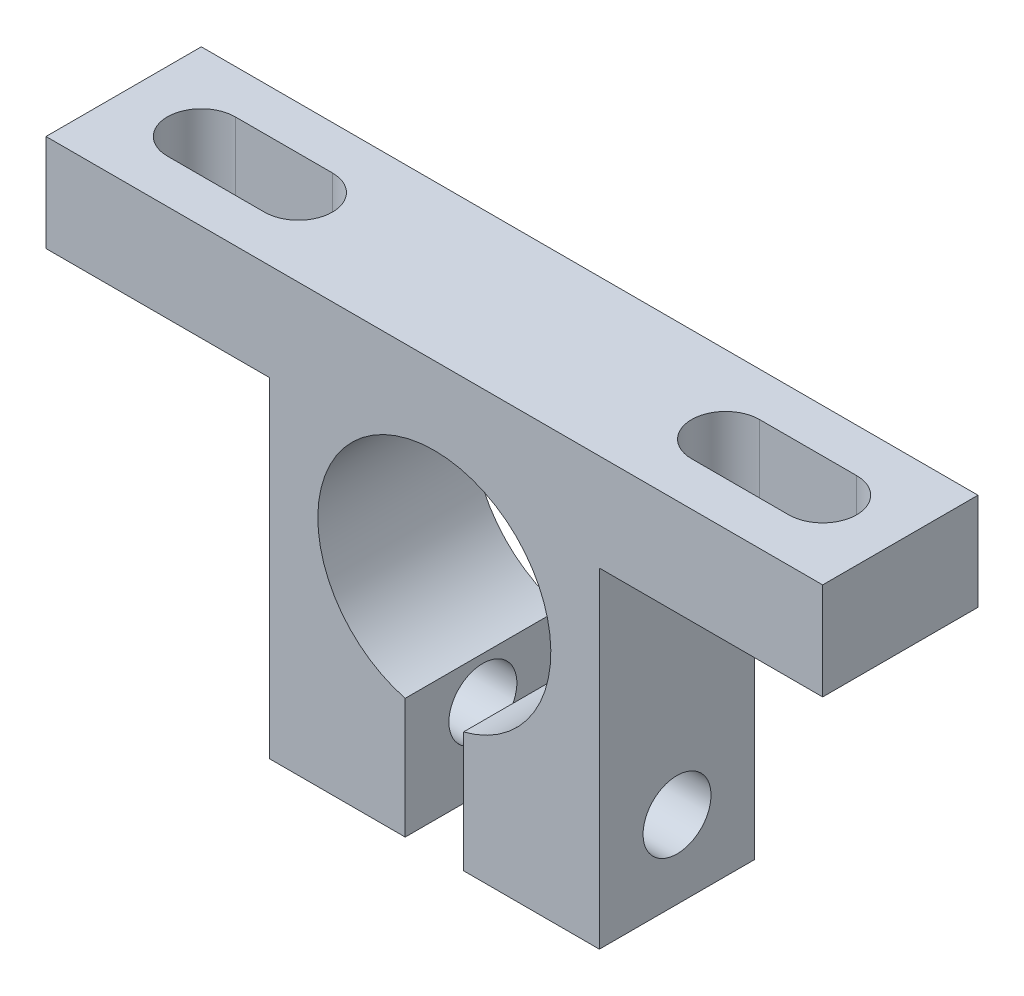
ISO-10303-21;
HEADER;
FILE_DESCRIPTION(('STEP AP214'),'2;1');
FILE_NAME('part.step','',(''),(''),'','','');
FILE_SCHEMA(('AUTOMOTIVE_DESIGN { 1 0 10303 214 1 1 1 1 }'));
ENDSEC;
DATA;
#1=APPLICATION_CONTEXT('core data for automotive mechanical design processes');
#2=APPLICATION_PROTOCOL_DEFINITION('international standard','automotive_design',2000,#1);
#3=PRODUCT_CONTEXT('',#1,'mechanical');
#4=PRODUCT('Part','Part','',(#3));
#5=PRODUCT_RELATED_PRODUCT_CATEGORY('part','',(#4));
#6=PRODUCT_DEFINITION_FORMATION('','',#4);
#7=PRODUCT_DEFINITION_CONTEXT('part definition',#1,'design');
#8=PRODUCT_DEFINITION('design','',#6,#7);
#9=PRODUCT_DEFINITION_SHAPE('','',#8);
#10=(LENGTH_UNIT() NAMED_UNIT(*) SI_UNIT(.MILLI.,.METRE.));
#11=(NAMED_UNIT(*) PLANE_ANGLE_UNIT() SI_UNIT($,.RADIAN.));
#12=(NAMED_UNIT(*) SI_UNIT($,.STERADIAN.) SOLID_ANGLE_UNIT());
#13=UNCERTAINTY_MEASURE_WITH_UNIT(LENGTH_MEASURE(1.E-05),#10,'distance_accuracy_value','');
#14=(GEOMETRIC_REPRESENTATION_CONTEXT(3) GLOBAL_UNCERTAINTY_ASSIGNED_CONTEXT((#13)) GLOBAL_UNIT_ASSIGNED_CONTEXT((#10,
#11,#12)) REPRESENTATION_CONTEXT('',''));
#15=CARTESIAN_POINT('',(0.,0.,0.));
#16=DIRECTION('',(0.,0.,1.));
#17=DIRECTION('',(1.,0.,0.));
#18=AXIS2_PLACEMENT_3D('',#15,#16,#17);
#19=CARTESIAN_POINT('',(8.5,-12.,8.));
#20=DIRECTION('',(0.,1.,0.));
#21=DIRECTION('',(0.,0.,1.));
#22=AXIS2_PLACEMENT_3D('',#19,#20,#21);
#23=PLANE('',#22);
#24=DIRECTION('',(1.,0.,0.));
#25=VECTOR('',#24,1.);
#26=CARTESIAN_POINT('',(8.5,-12.,0.));
#27=LINE('',#26,#25);
#28=CARTESIAN_POINT('',(1.5,-12.,0.));
#29=VERTEX_POINT('',#28);
#30=CARTESIAN_POINT('',(8.5,-12.,0.));
#31=VERTEX_POINT('',#30);
#32=EDGE_CURVE('E222',#29,#31,#27,.T.);
#33=ORIENTED_EDGE('',*,*,#32,.T.);
#34=DIRECTION('',(0.,0.,-1.));
#35=VECTOR('',#34,1.);
#36=CARTESIAN_POINT('',(8.5,-12.,8.));
#37=LINE('',#36,#35);
#38=CARTESIAN_POINT('',(8.5,-12.,8.));
#39=VERTEX_POINT('',#38);
#40=EDGE_CURVE('E311',#39,#31,#37,.T.);
#41=ORIENTED_EDGE('',*,*,#40,.F.);
#42=DIRECTION('',(1.,0.,0.));
#43=VECTOR('',#42,1.);
#44=CARTESIAN_POINT('',(8.5,-12.,8.));
#45=LINE('',#44,#43);
#46=CARTESIAN_POINT('',(1.5,-12.,8.));
#47=VERTEX_POINT('',#46);
#48=EDGE_CURVE('E229',#47,#39,#45,.T.);
#49=ORIENTED_EDGE('',*,*,#48,.F.);
#50=DIRECTION('',(0.,0.,-1.));
#51=VECTOR('',#50,1.);
#52=CARTESIAN_POINT('',(1.5,-12.,8.));
#53=LINE('',#52,#51);
#54=EDGE_CURVE('E255',#47,#29,#53,.T.);
#55=ORIENTED_EDGE('',*,*,#54,.T.);
#56=EDGE_LOOP('',(#33,#41,#49,#55));
#57=FACE_BOUND('',#56,.T.);
#58=ADVANCED_FACE('F34',(#57),#23,.F.);
#59=CARTESIAN_POINT('',(8.5,5.,8.));
#60=DIRECTION('',(-1.,0.,0.));
#61=DIRECTION('',(0.,0.,1.));
#62=AXIS2_PLACEMENT_3D('',#59,#60,#61);
#63=PLANE('',#62);
#64=CARTESIAN_POINT('',(8.5,-8.,4.));
#65=DIRECTION('',(-1.,0.,0.));
#66=DIRECTION('',(0.,0.,1.));
#67=AXIS2_PLACEMENT_3D('',#64,#65,#66);
#68=CIRCLE('',#67,1.75);
#69=CARTESIAN_POINT('',(8.5,-8.,5.75));
#70=VERTEX_POINT('',#69);
#71=EDGE_CURVE('E472',#70,#70,#68,.T.);
#72=ORIENTED_EDGE('',*,*,#71,.T.);
#73=EDGE_LOOP('',(#72));
#74=FACE_BOUND('',#73,.T.);
#75=DIRECTION('',(0.,1.,0.));
#76=VECTOR('',#75,1.);
#77=CARTESIAN_POINT('',(8.5,5.,0.));
#78=LINE('',#77,#76);
#79=CARTESIAN_POINT('',(8.5,5.,0.));
#80=VERTEX_POINT('',#79);
#81=EDGE_CURVE('E258',#31,#80,#78,.T.);
#82=ORIENTED_EDGE('',*,*,#81,.T.);
#83=DIRECTION('',(0.,0.,-1.));
#84=VECTOR('',#83,1.);
#85=CARTESIAN_POINT('',(8.5,5.,8.));
#86=LINE('',#85,#84);
#87=CARTESIAN_POINT('',(8.5,5.,8.));
#88=VERTEX_POINT('',#87);
#89=EDGE_CURVE('E308',#88,#80,#86,.T.);
#90=ORIENTED_EDGE('',*,*,#89,.F.);
#91=DIRECTION('',(0.,1.,0.));
#92=VECTOR('',#91,1.);
#93=CARTESIAN_POINT('',(8.5,5.,8.));
#94=LINE('',#93,#92);
#95=EDGE_CURVE('E232',#39,#88,#94,.T.);
#96=ORIENTED_EDGE('',*,*,#95,.F.);
#97=ORIENTED_EDGE('',*,*,#40,.T.);
#98=EDGE_LOOP('',(#82,#90,#96,#97));
#99=FACE_BOUND('',#98,.T.);
#100=ADVANCED_FACE('F353',(#74,#99),#63,.F.);
#101=CARTESIAN_POINT('',(20.,5.,8.));
#102=DIRECTION('',(0.,1.,0.));
#103=DIRECTION('',(0.,0.,1.));
#104=AXIS2_PLACEMENT_3D('',#101,#102,#103);
#105=PLANE('',#104);
#106=DIRECTION('',(1.,0.,0.));
#107=VECTOR('',#106,1.);
#108=CARTESIAN_POINT('',(20.,5.,5.75000000000001));
#109=LINE('',#108,#107);
#110=CARTESIAN_POINT('',(11.,5.,5.75000000000001));
#111=VERTEX_POINT('',#110);
#112=CARTESIAN_POINT('',(16.,5.,5.75000000000001));
#113=VERTEX_POINT('',#112);
#114=EDGE_CURVE('E202',#111,#113,#109,.T.);
#115=ORIENTED_EDGE('',*,*,#114,.T.);
#116=CARTESIAN_POINT('',(16.,5.,4.00000000000001));
#117=DIRECTION('',(0.,1.,0.));
#118=DIRECTION('',(0.,0.,1.));
#119=AXIS2_PLACEMENT_3D('',#116,#117,#118);
#120=CIRCLE('',#119,1.75);
#121=CARTESIAN_POINT('',(16.,5.,2.25000000000001));
#122=VERTEX_POINT('',#121);
#123=EDGE_CURVE('E205',#113,#122,#120,.T.);
#124=ORIENTED_EDGE('',*,*,#123,.T.);
#125=DIRECTION('',(-1.,0.,0.));
#126=VECTOR('',#125,1.);
#127=CARTESIAN_POINT('',(20.,5.,2.25000000000001));
#128=LINE('',#127,#126);
#129=CARTESIAN_POINT('',(11.,5.,2.25000000000001));
#130=VERTEX_POINT('',#129);
#131=EDGE_CURVE('E197',#122,#130,#128,.T.);
#132=ORIENTED_EDGE('',*,*,#131,.T.);
#133=CARTESIAN_POINT('',(11.,5.,4.00000000000001));
#134=DIRECTION('',(0.,1.,0.));
#135=DIRECTION('',(0.,0.,1.));
#136=AXIS2_PLACEMENT_3D('',#133,#134,#135);
#137=CIRCLE('',#136,1.75);
#138=EDGE_CURVE('E177',#130,#111,#137,.T.);
#139=ORIENTED_EDGE('',*,*,#138,.T.);
#140=EDGE_LOOP('',(#115,#124,#132,#139));
#141=FACE_BOUND('',#140,.T.);
#142=DIRECTION('',(1.,0.,0.));
#143=VECTOR('',#142,1.);
#144=CARTESIAN_POINT('',(20.,5.,0.));
#145=LINE('',#144,#143);
#146=CARTESIAN_POINT('',(20.,5.,0.));
#147=VERTEX_POINT('',#146);
#148=EDGE_CURVE('E260',#80,#147,#145,.T.);
#149=ORIENTED_EDGE('',*,*,#148,.T.);
#150=DIRECTION('',(0.,0.,-1.));
#151=VECTOR('',#150,1.);
#152=CARTESIAN_POINT('',(20.,5.,8.));
#153=LINE('',#152,#151);
#154=CARTESIAN_POINT('',(20.,5.,8.));
#155=VERTEX_POINT('',#154);
#156=EDGE_CURVE('E305',#155,#147,#153,.T.);
#157=ORIENTED_EDGE('',*,*,#156,.F.);
#158=DIRECTION('',(1.,0.,0.));
#159=VECTOR('',#158,1.);
#160=CARTESIAN_POINT('',(20.,5.,8.));
#161=LINE('',#160,#159);
#162=EDGE_CURVE('E235',#88,#155,#161,.T.);
#163=ORIENTED_EDGE('',*,*,#162,.F.);
#164=ORIENTED_EDGE('',*,*,#89,.T.);
#165=EDGE_LOOP('',(#149,#157,#163,#164));
#166=FACE_BOUND('',#165,.T.);
#167=ADVANCED_FACE('F358',(#141,#166),#105,.F.);
#168=CARTESIAN_POINT('',(20.,10.,8.));
#169=DIRECTION('',(-1.,0.,0.));
#170=DIRECTION('',(0.,0.,1.));
#171=AXIS2_PLACEMENT_3D('',#168,#169,#170);
#172=PLANE('',#171);
#173=DIRECTION('',(0.,1.,0.));
#174=VECTOR('',#173,1.);
#175=CARTESIAN_POINT('',(20.,10.,0.));
#176=LINE('',#175,#174);
#177=CARTESIAN_POINT('',(20.,10.,0.));
#178=VERTEX_POINT('',#177);
#179=EDGE_CURVE('E262',#147,#178,#176,.T.);
#180=ORIENTED_EDGE('',*,*,#179,.T.);
#181=DIRECTION('',(0.,0.,-1.));
#182=VECTOR('',#181,1.);
#183=CARTESIAN_POINT('',(20.,10.,8.));
#184=LINE('',#183,#182);
#185=CARTESIAN_POINT('',(20.,10.,8.));
#186=VERTEX_POINT('',#185);
#187=EDGE_CURVE('E302',#186,#178,#184,.T.);
#188=ORIENTED_EDGE('',*,*,#187,.F.);
#189=DIRECTION('',(0.,1.,0.));
#190=VECTOR('',#189,1.);
#191=CARTESIAN_POINT('',(20.,10.,8.));
#192=LINE('',#191,#190);
#193=EDGE_CURVE('E237',#155,#186,#192,.T.);
#194=ORIENTED_EDGE('',*,*,#193,.F.);
#195=ORIENTED_EDGE('',*,*,#156,.T.);
#196=EDGE_LOOP('',(#180,#188,#194,#195));
#197=FACE_BOUND('',#196,.T.);
#198=ADVANCED_FACE('F410',(#197),#172,.F.);
#199=CARTESIAN_POINT('',(20.,10.,8.));
#200=DIRECTION('',(0.,-1.,0.));
#201=DIRECTION('',(0.,0.,-1.));
#202=AXIS2_PLACEMENT_3D('',#199,#200,#201);
#203=PLANE('',#202);
#204=DIRECTION('',(-1.,0.,0.));
#205=VECTOR('',#204,1.);
#206=CARTESIAN_POINT('',(16.,10.,2.25000000000001));
#207=LINE('',#206,#205);
#208=CARTESIAN_POINT('',(16.,10.,2.25000000000001));
#209=VERTEX_POINT('',#208);
#210=CARTESIAN_POINT('',(11.,10.,2.25000000000001));
#211=VERTEX_POINT('',#210);
#212=EDGE_CURVE('E183',#209,#211,#207,.T.);
#213=ORIENTED_EDGE('',*,*,#212,.F.);
#214=CARTESIAN_POINT('',(16.,10.,4.00000000000001));
#215=DIRECTION('',(0.,1.,0.));
#216=DIRECTION('',(0.,0.,-1.));
#217=AXIS2_PLACEMENT_3D('',#214,#215,#216);
#218=CIRCLE('',#217,1.75);
#219=CARTESIAN_POINT('',(16.,10.,5.75000000000001));
#220=VERTEX_POINT('',#219);
#221=EDGE_CURVE('E57',#220,#209,#218,.T.);
#222=ORIENTED_EDGE('',*,*,#221,.F.);
#223=DIRECTION('',(1.,0.,0.));
#224=VECTOR('',#223,1.);
#225=CARTESIAN_POINT('',(16.,10.,5.75000000000001));
#226=LINE('',#225,#224);
#227=CARTESIAN_POINT('',(11.,10.,5.75000000000001));
#228=VERTEX_POINT('',#227);
#229=EDGE_CURVE('E190',#228,#220,#226,.T.);
#230=ORIENTED_EDGE('',*,*,#229,.F.);
#231=CARTESIAN_POINT('',(11.,10.,4.00000000000001));
#232=DIRECTION('',(0.,1.,0.));
#233=DIRECTION('',(0.,0.,-1.));
#234=AXIS2_PLACEMENT_3D('',#231,#232,#233);
#235=CIRCLE('',#234,1.75);
#236=EDGE_CURVE('E174',#211,#228,#235,.T.);
#237=ORIENTED_EDGE('',*,*,#236,.F.);
#238=EDGE_LOOP('',(#213,#222,#230,#237));
#239=FACE_BOUND('',#238,.T.);
#240=DIRECTION('',(1.,0.,0.));
#241=VECTOR('',#240,1.);
#242=CARTESIAN_POINT('',(-16.,10.,5.75000000000001));
#243=LINE('',#242,#241);
#244=CARTESIAN_POINT('',(-16.,10.,5.75000000000001));
#245=VERTEX_POINT('',#244);
#246=CARTESIAN_POINT('',(-11.,10.,5.75000000000001));
#247=VERTEX_POINT('',#246);
#248=EDGE_CURVE('E210',#245,#247,#243,.T.);
#249=ORIENTED_EDGE('',*,*,#248,.F.);
#250=CARTESIAN_POINT('',(-16.,10.,4.00000000000001));
#251=DIRECTION('',(0.,1.,0.));
#252=DIRECTION('',(0.,0.,1.));
#253=AXIS2_PLACEMENT_3D('',#250,#251,#252);
#254=CIRCLE('',#253,1.75);
#255=CARTESIAN_POINT('',(-16.,10.,2.25000000000001));
#256=VERTEX_POINT('',#255);
#257=EDGE_CURVE('E208',#256,#245,#254,.T.);
#258=ORIENTED_EDGE('',*,*,#257,.F.);
#259=DIRECTION('',(-1.,0.,0.));
#260=VECTOR('',#259,1.);
#261=CARTESIAN_POINT('',(-16.,10.,2.25000000000001));
#262=LINE('',#261,#260);
#263=CARTESIAN_POINT('',(-11.,10.,2.25000000000001));
#264=VERTEX_POINT('',#263);
#265=EDGE_CURVE('E216',#264,#256,#262,.T.);
#266=ORIENTED_EDGE('',*,*,#265,.F.);
#267=CARTESIAN_POINT('',(-11.,10.,4.00000000000001));
#268=DIRECTION('',(0.,1.,0.));
#269=DIRECTION('',(0.,0.,1.));
#270=AXIS2_PLACEMENT_3D('',#267,#268,#269);
#271=CIRCLE('',#270,1.75);
#272=EDGE_CURVE('E213',#247,#264,#271,.T.);
#273=ORIENTED_EDGE('',*,*,#272,.F.);
#274=EDGE_LOOP('',(#249,#258,#266,#273));
#275=FACE_BOUND('',#274,.T.);
#276=DIRECTION('',(-1.,0.,0.));
#277=VECTOR('',#276,1.);
#278=CARTESIAN_POINT('',(20.,10.,0.));
#279=LINE('',#278,#277);
#280=CARTESIAN_POINT('',(-20.,10.,0.));
#281=VERTEX_POINT('',#280);
#282=EDGE_CURVE('E264',#178,#281,#279,.T.);
#283=ORIENTED_EDGE('',*,*,#282,.T.);
#284=DIRECTION('',(0.,0.,-1.));
#285=VECTOR('',#284,1.);
#286=CARTESIAN_POINT('',(-20.,10.,8.));
#287=LINE('',#286,#285);
#288=CARTESIAN_POINT('',(-20.,10.,8.));
#289=VERTEX_POINT('',#288);
#290=EDGE_CURVE('E299',#289,#281,#287,.T.);
#291=ORIENTED_EDGE('',*,*,#290,.F.);
#292=DIRECTION('',(-1.,0.,0.));
#293=VECTOR('',#292,1.);
#294=CARTESIAN_POINT('',(20.,10.,8.));
#295=LINE('',#294,#293);
#296=EDGE_CURVE('E239',#186,#289,#295,.T.);
#297=ORIENTED_EDGE('',*,*,#296,.F.);
#298=ORIENTED_EDGE('',*,*,#187,.T.);
#299=EDGE_LOOP('',(#283,#291,#297,#298));
#300=FACE_BOUND('',#299,.T.);
#301=ADVANCED_FACE('F187',(#239,#275,#300),#203,.F.);
#302=CARTESIAN_POINT('',(-20.,10.,8.));
#303=DIRECTION('',(1.,0.,0.));
#304=DIRECTION('',(0.,0.,-1.));
#305=AXIS2_PLACEMENT_3D('',#302,#303,#304);
#306=PLANE('',#305);
#307=DIRECTION('',(0.,-1.,0.));
#308=VECTOR('',#307,1.);
#309=CARTESIAN_POINT('',(-20.,10.,0.));
#310=LINE('',#309,#308);
#311=CARTESIAN_POINT('',(-20.,5.,0.));
#312=VERTEX_POINT('',#311);
#313=EDGE_CURVE('E266',#281,#312,#310,.T.);
#314=ORIENTED_EDGE('',*,*,#313,.T.);
#315=DIRECTION('',(0.,0.,-1.));
#316=VECTOR('',#315,1.);
#317=CARTESIAN_POINT('',(-20.,5.,8.));
#318=LINE('',#317,#316);
#319=CARTESIAN_POINT('',(-20.,5.,8.));
#320=VERTEX_POINT('',#319);
#321=EDGE_CURVE('E296',#320,#312,#318,.T.);
#322=ORIENTED_EDGE('',*,*,#321,.F.);
#323=DIRECTION('',(0.,-1.,0.));
#324=VECTOR('',#323,1.);
#325=CARTESIAN_POINT('',(-20.,10.,8.));
#326=LINE('',#325,#324);
#327=EDGE_CURVE('E241',#289,#320,#326,.T.);
#328=ORIENTED_EDGE('',*,*,#327,.F.);
#329=ORIENTED_EDGE('',*,*,#290,.T.);
#330=EDGE_LOOP('',(#314,#322,#328,#329));
#331=FACE_BOUND('',#330,.T.);
#332=ADVANCED_FACE('F405',(#331),#306,.F.);
#333=CARTESIAN_POINT('',(-20.,5.,8.));
#334=DIRECTION('',(0.,1.,0.));
#335=DIRECTION('',(0.,0.,1.));
#336=AXIS2_PLACEMENT_3D('',#333,#334,#335);
#337=PLANE('',#336);
#338=DIRECTION('',(-1.,0.,0.));
#339=VECTOR('',#338,1.);
#340=CARTESIAN_POINT('',(-20.,5.,2.25000000000001));
#341=LINE('',#340,#339);
#342=CARTESIAN_POINT('',(-11.,5.,2.25000000000001));
#343=VERTEX_POINT('',#342);
#344=CARTESIAN_POINT('',(-16.,5.,2.25000000000001));
#345=VERTEX_POINT('',#344);
#346=EDGE_CURVE('E42',#343,#345,#341,.T.);
#347=ORIENTED_EDGE('',*,*,#346,.T.);
#348=CARTESIAN_POINT('',(-16.,5.,4.00000000000001));
#349=DIRECTION('',(0.,1.,0.));
#350=DIRECTION('',(0.,0.,1.));
#351=AXIS2_PLACEMENT_3D('',#348,#349,#350);
#352=CIRCLE('',#351,1.75);
#353=CARTESIAN_POINT('',(-16.,5.,5.75000000000001));
#354=VERTEX_POINT('',#353);
#355=EDGE_CURVE('E11',#345,#354,#352,.T.);
#356=ORIENTED_EDGE('',*,*,#355,.T.);
#357=DIRECTION('',(1.,0.,0.));
#358=VECTOR('',#357,1.);
#359=CARTESIAN_POINT('',(-20.,5.,5.75000000000001));
#360=LINE('',#359,#358);
#361=CARTESIAN_POINT('',(-11.,5.,5.75000000000001));
#362=VERTEX_POINT('',#361);
#363=EDGE_CURVE('E314',#354,#362,#360,.T.);
#364=ORIENTED_EDGE('',*,*,#363,.T.);
#365=CARTESIAN_POINT('',(-11.,5.,4.00000000000001));
#366=DIRECTION('',(0.,1.,0.));
#367=DIRECTION('',(0.,0.,1.));
#368=AXIS2_PLACEMENT_3D('',#365,#366,#367);
#369=CIRCLE('',#368,1.75);
#370=EDGE_CURVE('E317',#362,#343,#369,.T.);
#371=ORIENTED_EDGE('',*,*,#370,.T.);
#372=EDGE_LOOP('',(#347,#356,#364,#371));
#373=FACE_BOUND('',#372,.T.);
#374=DIRECTION('',(1.,0.,0.));
#375=VECTOR('',#374,1.);
#376=CARTESIAN_POINT('',(-20.,5.,0.));
#377=LINE('',#376,#375);
#378=CARTESIAN_POINT('',(-8.5,5.,0.));
#379=VERTEX_POINT('',#378);
#380=EDGE_CURVE('E268',#312,#379,#377,.T.);
#381=ORIENTED_EDGE('',*,*,#380,.T.);
#382=DIRECTION('',(0.,0.,-1.));
#383=VECTOR('',#382,1.);
#384=CARTESIAN_POINT('',(-8.5,5.,8.));
#385=LINE('',#384,#383);
#386=CARTESIAN_POINT('',(-8.5,5.,8.));
#387=VERTEX_POINT('',#386);
#388=EDGE_CURVE('E293',#387,#379,#385,.T.);
#389=ORIENTED_EDGE('',*,*,#388,.F.);
#390=DIRECTION('',(1.,0.,0.));
#391=VECTOR('',#390,1.);
#392=CARTESIAN_POINT('',(-20.,5.,8.));
#393=LINE('',#392,#391);
#394=EDGE_CURVE('E243',#320,#387,#393,.T.);
#395=ORIENTED_EDGE('',*,*,#394,.F.);
#396=ORIENTED_EDGE('',*,*,#321,.T.);
#397=EDGE_LOOP('',(#381,#389,#395,#396));
#398=FACE_BOUND('',#397,.T.);
#399=ADVANCED_FACE('F322',(#373,#398),#337,.F.);
#400=CARTESIAN_POINT('',(-8.5,5.,8.));
#401=DIRECTION('',(1.,0.,0.));
#402=DIRECTION('',(0.,0.,-1.));
#403=AXIS2_PLACEMENT_3D('',#400,#401,#402);
#404=PLANE('',#403);
#405=CARTESIAN_POINT('',(-8.5,-8.,4.));
#406=DIRECTION('',(-1.,0.,0.));
#407=DIRECTION('',(0.,0.,1.));
#408=AXIS2_PLACEMENT_3D('',#405,#406,#407);
#409=CIRCLE('',#408,1.75);
#410=CARTESIAN_POINT('',(-8.5,-8.,5.75));
#411=VERTEX_POINT('',#410);
#412=EDGE_CURVE('E478',#411,#411,#409,.T.);
#413=ORIENTED_EDGE('',*,*,#412,.F.);
#414=EDGE_LOOP('',(#413));
#415=FACE_BOUND('',#414,.T.);
#416=DIRECTION('',(0.,-1.,0.));
#417=VECTOR('',#416,1.);
#418=CARTESIAN_POINT('',(-8.5,5.,0.));
#419=LINE('',#418,#417);
#420=CARTESIAN_POINT('',(-8.5,-12.,0.));
#421=VERTEX_POINT('',#420);
#422=EDGE_CURVE('E270',#379,#421,#419,.T.);
#423=ORIENTED_EDGE('',*,*,#422,.T.);
#424=DIRECTION('',(0.,0.,-1.));
#425=VECTOR('',#424,1.);
#426=CARTESIAN_POINT('',(-8.5,-12.,8.));
#427=LINE('',#426,#425);
#428=CARTESIAN_POINT('',(-8.5,-12.,8.));
#429=VERTEX_POINT('',#428);
#430=EDGE_CURVE('E290',#429,#421,#427,.T.);
#431=ORIENTED_EDGE('',*,*,#430,.F.);
#432=DIRECTION('',(0.,-1.,0.));
#433=VECTOR('',#432,1.);
#434=CARTESIAN_POINT('',(-8.5,5.,8.));
#435=LINE('',#434,#433);
#436=EDGE_CURVE('E245',#387,#429,#435,.T.);
#437=ORIENTED_EDGE('',*,*,#436,.F.);
#438=ORIENTED_EDGE('',*,*,#388,.T.);
#439=EDGE_LOOP('',(#423,#431,#437,#438));
#440=FACE_BOUND('',#439,.T.);
#441=ADVANCED_FACE('F396',(#415,#440),#404,.F.);
#442=CARTESIAN_POINT('',(-8.5,-12.,8.));
#443=DIRECTION('',(0.,1.,0.));
#444=DIRECTION('',(0.,0.,1.));
#445=AXIS2_PLACEMENT_3D('',#442,#443,#444);
#446=PLANE('',#445);
#447=DIRECTION('',(1.,0.,0.));
#448=VECTOR('',#447,1.);
#449=CARTESIAN_POINT('',(-8.5,-12.,0.));
#450=LINE('',#449,#448);
#451=CARTESIAN_POINT('',(-1.5,-12.,0.));
#452=VERTEX_POINT('',#451);
#453=EDGE_CURVE('E272',#421,#452,#450,.T.);
#454=ORIENTED_EDGE('',*,*,#453,.T.);
#455=DIRECTION('',(0.,0.,-1.));
#456=VECTOR('',#455,1.);
#457=CARTESIAN_POINT('',(-1.5,-12.,8.));
#458=LINE('',#457,#456);
#459=CARTESIAN_POINT('',(-1.5,-12.,8.));
#460=VERTEX_POINT('',#459);
#461=EDGE_CURVE('E287',#460,#452,#458,.T.);
#462=ORIENTED_EDGE('',*,*,#461,.F.);
#463=DIRECTION('',(1.,0.,0.));
#464=VECTOR('',#463,1.);
#465=CARTESIAN_POINT('',(-8.5,-12.,8.));
#466=LINE('',#465,#464);
#467=EDGE_CURVE('E247',#429,#460,#466,.T.);
#468=ORIENTED_EDGE('',*,*,#467,.F.);
#469=ORIENTED_EDGE('',*,*,#430,.T.);
#470=EDGE_LOOP('',(#454,#462,#468,#469));
#471=FACE_BOUND('',#470,.T.);
#472=ADVANCED_FACE('F392',(#471),#446,.F.);
#473=CARTESIAN_POINT('',(-1.5,-12.,8.));
#474=DIRECTION('',(-1.,0.,0.));
#475=DIRECTION('',(0.,0.,1.));
#476=AXIS2_PLACEMENT_3D('',#473,#474,#475);
#477=PLANE('',#476);
#478=CARTESIAN_POINT('',(-1.5,-8.,4.));
#479=DIRECTION('',(-1.,0.,0.));
#480=DIRECTION('',(0.,0.,1.));
#481=AXIS2_PLACEMENT_3D('',#478,#479,#480);
#482=CIRCLE('',#481,1.75);
#483=CARTESIAN_POINT('',(-1.5,-8.,5.75));
#484=VERTEX_POINT('',#483);
#485=EDGE_CURVE('E473',#484,#484,#482,.T.);
#486=ORIENTED_EDGE('',*,*,#485,.T.);
#487=EDGE_LOOP('',(#486));
#488=FACE_BOUND('',#487,.T.);
#489=DIRECTION('',(0.,1.,0.));
#490=VECTOR('',#489,1.);
#491=CARTESIAN_POINT('',(-1.5,-12.,0.));
#492=LINE('',#491,#490);
#493=CARTESIAN_POINT('',(-1.50000000000001,-5.80947501931112,0.));
#494=VERTEX_POINT('',#493);
#495=EDGE_CURVE('E274',#452,#494,#492,.T.);
#496=ORIENTED_EDGE('',*,*,#495,.T.);
#497=DIRECTION('',(0.,0.,-1.));
#498=VECTOR('',#497,1.);
#499=CARTESIAN_POINT('',(-1.50000000000001,-5.80947501931112,8.));
#500=LINE('',#499,#498);
#501=CARTESIAN_POINT('',(-1.50000000000001,-5.80947501931112,8.));
#502=VERTEX_POINT('',#501);
#503=EDGE_CURVE('E284',#502,#494,#500,.T.);
#504=ORIENTED_EDGE('',*,*,#503,.F.);
#505=DIRECTION('',(0.,1.,0.));
#506=VECTOR('',#505,1.);
#507=CARTESIAN_POINT('',(-1.5,-12.,8.));
#508=LINE('',#507,#506);
#509=EDGE_CURVE('E249',#460,#502,#508,.T.);
#510=ORIENTED_EDGE('',*,*,#509,.F.);
#511=ORIENTED_EDGE('',*,*,#461,.T.);
#512=EDGE_LOOP('',(#496,#504,#510,#511));
#513=FACE_BOUND('',#512,.T.);
#514=ADVANCED_FACE('F387',(#488,#513),#477,.F.);
#515=CARTESIAN_POINT('',(0.,0.,8.));
#516=DIRECTION('',(0.,0.,-1.));
#517=DIRECTION('',(-1.,0.,0.));
#518=AXIS2_PLACEMENT_3D('',#515,#516,#517);
#519=CYLINDRICAL_SURFACE('',#518,6.);
#520=CARTESIAN_POINT('',(0.,0.,0.));
#521=DIRECTION('',(0.,0.,-1.));
#522=DIRECTION('',(1.,0.,0.));
#523=AXIS2_PLACEMENT_3D('',#520,#521,#522);
#524=CIRCLE('',#523,6.);
#525=CARTESIAN_POINT('',(1.5,-5.80947501931113,0.));
#526=VERTEX_POINT('',#525);
#527=EDGE_CURVE('E276',#494,#526,#524,.T.);
#528=ORIENTED_EDGE('',*,*,#527,.T.);
#529=DIRECTION('',(0.,0.,-1.));
#530=VECTOR('',#529,1.);
#531=CARTESIAN_POINT('',(1.5,-5.80947501931113,8.));
#532=LINE('',#531,#530);
#533=CARTESIAN_POINT('',(1.5,-5.80947501931113,8.));
#534=VERTEX_POINT('',#533);
#535=EDGE_CURVE('E281',#534,#526,#532,.T.);
#536=ORIENTED_EDGE('',*,*,#535,.F.);
#537=CARTESIAN_POINT('',(0.,0.,8.));
#538=DIRECTION('',(0.,0.,-1.));
#539=DIRECTION('',(1.,0.,0.));
#540=AXIS2_PLACEMENT_3D('',#537,#538,#539);
#541=CIRCLE('',#540,6.);
#542=EDGE_CURVE('E251',#502,#534,#541,.T.);
#543=ORIENTED_EDGE('',*,*,#542,.F.);
#544=ORIENTED_EDGE('',*,*,#503,.T.);
#545=EDGE_LOOP('',(#528,#536,#543,#544));
#546=FACE_BOUND('',#545,.T.);
#547=ADVANCED_FACE('F381',(#546),#519,.F.);
#548=CARTESIAN_POINT('',(1.5,-12.,8.));
#549=DIRECTION('',(1.,0.,0.));
#550=DIRECTION('',(0.,0.,-1.));
#551=AXIS2_PLACEMENT_3D('',#548,#549,#550);
#552=PLANE('',#551);
#553=CARTESIAN_POINT('',(1.5,-8.,4.));
#554=DIRECTION('',(1.,0.,0.));
#555=DIRECTION('',(0.,0.,-1.));
#556=AXIS2_PLACEMENT_3D('',#553,#554,#555);
#557=CIRCLE('',#556,1.75);
#558=CARTESIAN_POINT('',(1.5,-8.,2.25));
#559=VERTEX_POINT('',#558);
#560=EDGE_CURVE('E37',#559,#559,#557,.T.);
#561=ORIENTED_EDGE('',*,*,#560,.T.);
#562=EDGE_LOOP('',(#561));
#563=FACE_BOUND('',#562,.T.);
#564=DIRECTION('',(0.,-1.,0.));
#565=VECTOR('',#564,1.);
#566=CARTESIAN_POINT('',(1.5,-12.,0.));
#567=LINE('',#566,#565);
#568=EDGE_CURVE('E233',#526,#29,#567,.T.);
#569=ORIENTED_EDGE('',*,*,#568,.T.);
#570=ORIENTED_EDGE('',*,*,#54,.F.);
#571=DIRECTION('',(0.,-1.,0.));
#572=VECTOR('',#571,1.);
#573=CARTESIAN_POINT('',(1.5,-12.,8.));
#574=LINE('',#573,#572);
#575=EDGE_CURVE('E253',#534,#47,#574,.T.);
#576=ORIENTED_EDGE('',*,*,#575,.F.);
#577=ORIENTED_EDGE('',*,*,#535,.T.);
#578=EDGE_LOOP('',(#569,#570,#576,#577));
#579=FACE_BOUND('',#578,.T.);
#580=ADVANCED_FACE('F379',(#563,#579),#552,.F.);
#581=CARTESIAN_POINT('',(0.,0.,8.));
#582=DIRECTION('',(0.,0.,1.));
#583=DIRECTION('',(1.,0.,0.));
#584=AXIS2_PLACEMENT_3D('',#581,#582,#583);
#585=PLANE('',#584);
#586=ORIENTED_EDGE('',*,*,#48,.T.);
#587=ORIENTED_EDGE('',*,*,#95,.T.);
#588=ORIENTED_EDGE('',*,*,#162,.T.);
#589=ORIENTED_EDGE('',*,*,#193,.T.);
#590=ORIENTED_EDGE('',*,*,#296,.T.);
#591=ORIENTED_EDGE('',*,*,#327,.T.);
#592=ORIENTED_EDGE('',*,*,#394,.T.);
#593=ORIENTED_EDGE('',*,*,#436,.T.);
#594=ORIENTED_EDGE('',*,*,#467,.T.);
#595=ORIENTED_EDGE('',*,*,#509,.T.);
#596=ORIENTED_EDGE('',*,*,#542,.T.);
#597=ORIENTED_EDGE('',*,*,#575,.T.);
#598=EDGE_LOOP('',(#586,#587,#588,#589,#590,#591,#592,#593,#594,#595,#596,#597));
#599=FACE_BOUND('',#598,.T.);
#600=ADVANCED_FACE('F374',(#599),#585,.T.);
#601=CARTESIAN_POINT('',(0.,0.,0.));
#602=DIRECTION('',(0.,0.,1.));
#603=DIRECTION('',(1.,0.,0.));
#604=AXIS2_PLACEMENT_3D('',#601,#602,#603);
#605=PLANE('',#604);
#606=ORIENTED_EDGE('',*,*,#32,.F.);
#607=ORIENTED_EDGE('',*,*,#568,.F.);
#608=ORIENTED_EDGE('',*,*,#527,.F.);
#609=ORIENTED_EDGE('',*,*,#495,.F.);
#610=ORIENTED_EDGE('',*,*,#453,.F.);
#611=ORIENTED_EDGE('',*,*,#422,.F.);
#612=ORIENTED_EDGE('',*,*,#380,.F.);
#613=ORIENTED_EDGE('',*,*,#313,.F.);
#614=ORIENTED_EDGE('',*,*,#282,.F.);
#615=ORIENTED_EDGE('',*,*,#179,.F.);
#616=ORIENTED_EDGE('',*,*,#148,.F.);
#617=ORIENTED_EDGE('',*,*,#81,.F.);
#618=EDGE_LOOP('',(#606,#607,#608,#609,#610,#611,#612,#613,#614,#615,#616,#617));
#619=FACE_BOUND('',#618,.T.);
#620=ADVANCED_FACE('F366',(#619),#605,.F.);
#621=CARTESIAN_POINT('',(-16.,2.,4.00000000000001));
#622=DIRECTION('',(0.,1.,0.));
#623=DIRECTION('',(0.,0.,1.));
#624=AXIS2_PLACEMENT_3D('',#621,#622,#623);
#625=CYLINDRICAL_SURFACE('',#624,1.75);
#626=DIRECTION('',(0.,1.,0.));
#627=VECTOR('',#626,1.);
#628=CARTESIAN_POINT('',(-16.,2.,2.25000000000001));
#629=LINE('',#628,#627);
#630=EDGE_CURVE('E220',#345,#256,#629,.T.);
#631=ORIENTED_EDGE('',*,*,#630,.T.);
#632=ORIENTED_EDGE('',*,*,#257,.T.);
#633=DIRECTION('',(0.,1.,0.));
#634=VECTOR('',#633,1.);
#635=CARTESIAN_POINT('',(-16.,2.,5.75000000000001));
#636=LINE('',#635,#634);
#637=EDGE_CURVE('E219',#354,#245,#636,.T.);
#638=ORIENTED_EDGE('',*,*,#637,.F.);
#639=ORIENTED_EDGE('',*,*,#355,.F.);
#640=EDGE_LOOP('',(#631,#632,#638,#639));
#641=FACE_BOUND('',#640,.T.);
#642=ADVANCED_FACE('F338',(#641),#625,.F.);
#643=CARTESIAN_POINT('',(-16.,2.,2.25000000000001));
#644=DIRECTION('',(0.,0.,-1.));
#645=DIRECTION('',(-1.,0.,0.));
#646=AXIS2_PLACEMENT_3D('',#643,#644,#645);
#647=PLANE('',#646);
#648=DIRECTION('',(0.,1.,0.));
#649=VECTOR('',#648,1.);
#650=CARTESIAN_POINT('',(-11.,2.,2.25000000000001));
#651=LINE('',#650,#649);
#652=EDGE_CURVE('E223',#343,#264,#651,.T.);
#653=ORIENTED_EDGE('',*,*,#652,.T.);
#654=ORIENTED_EDGE('',*,*,#265,.T.);
#655=ORIENTED_EDGE('',*,*,#630,.F.);
#656=ORIENTED_EDGE('',*,*,#346,.F.);
#657=EDGE_LOOP('',(#653,#654,#655,#656));
#658=FACE_BOUND('',#657,.T.);
#659=ADVANCED_FACE('F328',(#658),#647,.F.);
#660=CARTESIAN_POINT('',(-11.,2.,4.00000000000001));
#661=DIRECTION('',(0.,1.,0.));
#662=DIRECTION('',(0.,0.,1.));
#663=AXIS2_PLACEMENT_3D('',#660,#661,#662);
#664=CYLINDRICAL_SURFACE('',#663,1.75);
#665=DIRECTION('',(0.,1.,0.));
#666=VECTOR('',#665,1.);
#667=CARTESIAN_POINT('',(-11.,2.,5.75000000000001));
#668=LINE('',#667,#666);
#669=EDGE_CURVE('E225',#362,#247,#668,.T.);
#670=ORIENTED_EDGE('',*,*,#669,.T.);
#671=ORIENTED_EDGE('',*,*,#272,.T.);
#672=ORIENTED_EDGE('',*,*,#652,.F.);
#673=ORIENTED_EDGE('',*,*,#370,.F.);
#674=EDGE_LOOP('',(#670,#671,#672,#673));
#675=FACE_BOUND('',#674,.T.);
#676=ADVANCED_FACE('F330',(#675),#664,.F.);
#677=CARTESIAN_POINT('',(-16.,2.,5.75000000000001));
#678=DIRECTION('',(0.,0.,1.));
#679=DIRECTION('',(1.,0.,0.));
#680=AXIS2_PLACEMENT_3D('',#677,#678,#679);
#681=PLANE('',#680);
#682=ORIENTED_EDGE('',*,*,#637,.T.);
#683=ORIENTED_EDGE('',*,*,#248,.T.);
#684=ORIENTED_EDGE('',*,*,#669,.F.);
#685=ORIENTED_EDGE('',*,*,#363,.F.);
#686=EDGE_LOOP('',(#682,#683,#684,#685));
#687=FACE_BOUND('',#686,.T.);
#688=ADVANCED_FACE('F340',(#687),#681,.F.);
#689=CARTESIAN_POINT('',(16.,2.,4.00000000000001));
#690=DIRECTION('',(0.,1.,0.));
#691=DIRECTION('',(0.,0.,1.));
#692=AXIS2_PLACEMENT_3D('',#689,#690,#691);
#693=CYLINDRICAL_SURFACE('',#692,1.75);
#694=DIRECTION('',(0.,1.,0.));
#695=VECTOR('',#694,1.);
#696=CARTESIAN_POINT('',(16.,2.,5.75000000000001));
#697=LINE('',#696,#695);
#698=EDGE_CURVE('E195',#113,#220,#697,.T.);
#699=ORIENTED_EDGE('',*,*,#698,.T.);
#700=ORIENTED_EDGE('',*,*,#221,.T.);
#701=DIRECTION('',(0.,1.,0.));
#702=VECTOR('',#701,1.);
#703=CARTESIAN_POINT('',(16.,2.,2.25000000000001));
#704=LINE('',#703,#702);
#705=EDGE_CURVE('E180',#122,#209,#704,.T.);
#706=ORIENTED_EDGE('',*,*,#705,.F.);
#707=ORIENTED_EDGE('',*,*,#123,.F.);
#708=EDGE_LOOP('',(#699,#700,#706,#707));
#709=FACE_BOUND('',#708,.T.);
#710=ADVANCED_FACE('F342',(#709),#693,.F.);
#711=CARTESIAN_POINT('',(16.,2.,5.75000000000001));
#712=DIRECTION('',(0.,0.,1.));
#713=DIRECTION('',(1.,0.,0.));
#714=AXIS2_PLACEMENT_3D('',#711,#712,#713);
#715=PLANE('',#714);
#716=DIRECTION('',(0.,1.,0.));
#717=VECTOR('',#716,1.);
#718=CARTESIAN_POINT('',(11.,2.,5.75000000000001));
#719=LINE('',#718,#717);
#720=EDGE_CURVE('E179',#111,#228,#719,.T.);
#721=ORIENTED_EDGE('',*,*,#720,.T.);
#722=ORIENTED_EDGE('',*,*,#229,.T.);
#723=ORIENTED_EDGE('',*,*,#698,.F.);
#724=ORIENTED_EDGE('',*,*,#114,.F.);
#725=EDGE_LOOP('',(#721,#722,#723,#724));
#726=FACE_BOUND('',#725,.T.);
#727=ADVANCED_FACE('F348',(#726),#715,.F.);
#728=CARTESIAN_POINT('',(11.,2.,4.00000000000001));
#729=DIRECTION('',(0.,1.,0.));
#730=DIRECTION('',(0.,0.,1.));
#731=AXIS2_PLACEMENT_3D('',#728,#729,#730);
#732=CYLINDRICAL_SURFACE('',#731,1.75);
#733=DIRECTION('',(0.,1.,0.));
#734=VECTOR('',#733,1.);
#735=CARTESIAN_POINT('',(11.,2.,2.25000000000001));
#736=LINE('',#735,#734);
#737=EDGE_CURVE('E49',#130,#211,#736,.T.);
#738=ORIENTED_EDGE('',*,*,#737,.T.);
#739=ORIENTED_EDGE('',*,*,#236,.T.);
#740=ORIENTED_EDGE('',*,*,#720,.F.);
#741=ORIENTED_EDGE('',*,*,#138,.F.);
#742=EDGE_LOOP('',(#738,#739,#740,#741));
#743=FACE_BOUND('',#742,.T.);
#744=ADVANCED_FACE('F171',(#743),#732,.F.);
#745=CARTESIAN_POINT('',(16.,2.,2.25000000000001));
#746=DIRECTION('',(0.,0.,-1.));
#747=DIRECTION('',(-1.,0.,0.));
#748=AXIS2_PLACEMENT_3D('',#745,#746,#747);
#749=PLANE('',#748);
#750=ORIENTED_EDGE('',*,*,#705,.T.);
#751=ORIENTED_EDGE('',*,*,#212,.T.);
#752=ORIENTED_EDGE('',*,*,#737,.F.);
#753=ORIENTED_EDGE('',*,*,#131,.F.);
#754=EDGE_LOOP('',(#750,#751,#752,#753));
#755=FACE_BOUND('',#754,.T.);
#756=ADVANCED_FACE('F184',(#755),#749,.F.);
#757=CARTESIAN_POINT('',(17.5,-8.,4.));
#758=DIRECTION('',(-1.,0.,0.));
#759=DIRECTION('',(0.,0.,1.));
#760=AXIS2_PLACEMENT_3D('',#757,#758,#759);
#761=CYLINDRICAL_SURFACE('',#760,1.75);
#762=ORIENTED_EDGE('',*,*,#560,.F.);
#763=EDGE_LOOP('',(#762));
#764=FACE_BOUND('',#763,.T.);
#765=ORIENTED_EDGE('',*,*,#71,.F.);
#766=EDGE_LOOP('',(#765));
#767=FACE_BOUND('',#766,.T.);
#768=ADVANCED_FACE('F454',(#764,#767),#761,.F.);
#769=ORIENTED_EDGE('',*,*,#412,.T.);
#770=EDGE_LOOP('',(#769));
#771=FACE_BOUND('',#770,.T.);
#772=ORIENTED_EDGE('',*,*,#485,.F.);
#773=EDGE_LOOP('',(#772));
#774=FACE_BOUND('',#773,.T.);
#775=ADVANCED_FACE('F461',(#771,#774),#761,.F.);
#776=CLOSED_SHELL('',(#58,#100,#167,#198,#301,#332,#399,#441,#472,#514,#547,#580,#600,#620,#642,
#659,#676,#688,#710,#727,#744,#756,#768,#775));
#777=MANIFOLD_SOLID_BREP('B2',#776);
#778=ADVANCED_BREP_SHAPE_REPRESENTATION('',(#18,#777),#14);
#779=SHAPE_DEFINITION_REPRESENTATION(#9,#778);
ENDSEC;
END-ISO-10303-21;
